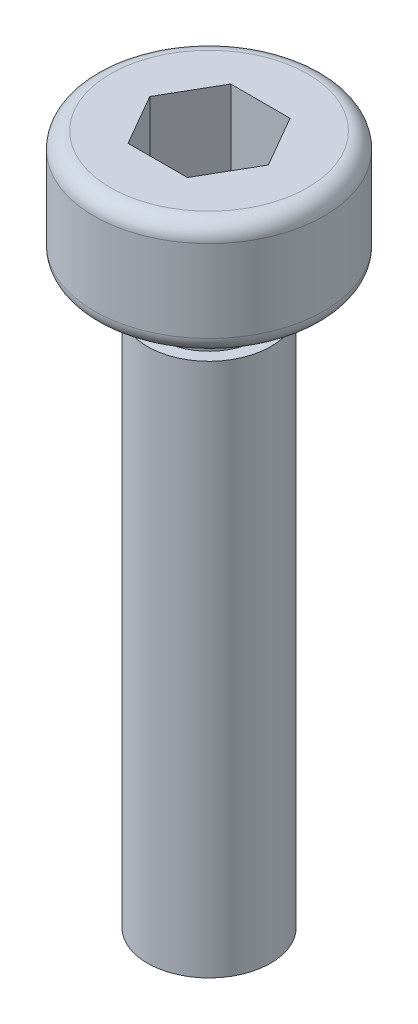
ISO-10303-21;
HEADER;
FILE_DESCRIPTION(('STEP AP214'),'2;1');
FILE_NAME('part.step','',(''),(''),'','','');
FILE_SCHEMA(('AUTOMOTIVE_DESIGN { 1 0 10303 214 1 1 1 1 }'));
ENDSEC;
DATA;
#1=APPLICATION_CONTEXT('core data for automotive mechanical design processes');
#2=APPLICATION_PROTOCOL_DEFINITION('international standard','automotive_design',2000,#1);
#3=PRODUCT_CONTEXT('',#1,'mechanical');
#4=PRODUCT('Part','Part','',(#3));
#5=PRODUCT_RELATED_PRODUCT_CATEGORY('part','',(#4));
#6=PRODUCT_DEFINITION_FORMATION('','',#4);
#7=PRODUCT_DEFINITION_CONTEXT('part definition',#1,'design');
#8=PRODUCT_DEFINITION('design','',#6,#7);
#9=PRODUCT_DEFINITION_SHAPE('','',#8);
#10=(LENGTH_UNIT() NAMED_UNIT(*) SI_UNIT(.MILLI.,.METRE.));
#11=(NAMED_UNIT(*) PLANE_ANGLE_UNIT() SI_UNIT($,.RADIAN.));
#12=(NAMED_UNIT(*) SI_UNIT($,.STERADIAN.) SOLID_ANGLE_UNIT());
#13=UNCERTAINTY_MEASURE_WITH_UNIT(LENGTH_MEASURE(1.E-05),#10,'distance_accuracy_value','');
#14=(GEOMETRIC_REPRESENTATION_CONTEXT(3) GLOBAL_UNCERTAINTY_ASSIGNED_CONTEXT((#13)) GLOBAL_UNIT_ASSIGNED_CONTEXT((#10,
#11,#12)) REPRESENTATION_CONTEXT('',''));
#15=CARTESIAN_POINT('',(0.,0.,0.));
#16=DIRECTION('',(0.,0.,1.));
#17=DIRECTION('',(1.,0.,0.));
#18=AXIS2_PLACEMENT_3D('',#15,#16,#17);
#19=CARTESIAN_POINT('',(0.,16.8,0.));
#20=DIRECTION('',(0.,-1.,0.));
#21=DIRECTION('',(0.,0.,-1.));
#22=AXIS2_PLACEMENT_3D('',#19,#20,#21);
#23=PLANE('',#22);
#24=DIRECTION('',(-0.5,0.,0.866025403784439));
#25=VECTOR('',#24,1.);
#26=CARTESIAN_POINT('',(-0.721687836487032,16.8,-1.25));
#27=LINE('',#26,#25);
#28=CARTESIAN_POINT('',(-0.721687836487032,16.8,-1.25));
#29=VERTEX_POINT('',#28);
#30=CARTESIAN_POINT('',(-1.44337567297406,16.8,0.));
#31=VERTEX_POINT('',#30);
#32=EDGE_CURVE('E126',#29,#31,#27,.T.);
#33=ORIENTED_EDGE('',*,*,#32,.F.);
#34=DIRECTION('',(-1.,0.,0.));
#35=VECTOR('',#34,1.);
#36=CARTESIAN_POINT('',(0.721687836487033,16.8,-1.25));
#37=LINE('',#36,#35);
#38=CARTESIAN_POINT('',(0.721687836487033,16.8,-1.25));
#39=VERTEX_POINT('',#38);
#40=EDGE_CURVE('E52',#39,#29,#37,.T.);
#41=ORIENTED_EDGE('',*,*,#40,.F.);
#42=DIRECTION('',(-0.5,0.,-0.866025403784439));
#43=VECTOR('',#42,1.);
#44=CARTESIAN_POINT('',(1.44337567297406,16.8,0.));
#45=LINE('',#44,#43);
#46=CARTESIAN_POINT('',(1.44337567297406,16.8,0.));
#47=VERTEX_POINT('',#46);
#48=EDGE_CURVE('E135',#47,#39,#45,.T.);
#49=ORIENTED_EDGE('',*,*,#48,.F.);
#50=DIRECTION('',(0.5,0.,-0.866025403784439));
#51=VECTOR('',#50,1.);
#52=CARTESIAN_POINT('',(0.721687836487032,16.8,1.25));
#53=LINE('',#52,#51);
#54=CARTESIAN_POINT('',(0.721687836487032,16.8,1.25));
#55=VERTEX_POINT('',#54);
#56=EDGE_CURVE('E133',#55,#47,#53,.T.);
#57=ORIENTED_EDGE('',*,*,#56,.F.);
#58=DIRECTION('',(1.,0.,0.));
#59=VECTOR('',#58,1.);
#60=CARTESIAN_POINT('',(-0.721687836487033,16.8,1.25));
#61=LINE('',#60,#59);
#62=CARTESIAN_POINT('',(-0.721687836487033,16.8,1.25));
#63=VERTEX_POINT('',#62);
#64=EDGE_CURVE('E100',#63,#55,#61,.T.);
#65=ORIENTED_EDGE('',*,*,#64,.F.);
#66=DIRECTION('',(0.5,0.,0.866025403784439));
#67=VECTOR('',#66,1.);
#68=CARTESIAN_POINT('',(-1.44337567297406,16.8,0.));
#69=LINE('',#68,#67);
#70=EDGE_CURVE('E129',#31,#63,#69,.T.);
#71=ORIENTED_EDGE('',*,*,#70,.F.);
#72=EDGE_LOOP('',(#33,#41,#49,#57,#65,#71));
#73=FACE_BOUND('',#72,.T.);
#74=CARTESIAN_POINT('',(0.,16.8,0.));
#75=DIRECTION('',(0.,-1.,0.));
#76=DIRECTION('',(0.,0.,-1.));
#77=AXIS2_PLACEMENT_3D('',#74,#75,#76);
#78=CIRCLE('',#77,2.4);
#79=CARTESIAN_POINT('',(0.,16.8,-2.4));
#80=VERTEX_POINT('',#79);
#81=EDGE_CURVE('E11',#80,#80,#78,.T.);
#82=ORIENTED_EDGE('',*,*,#81,.F.);
#83=EDGE_LOOP('',(#82));
#84=FACE_BOUND('',#83,.T.);
#85=ADVANCED_FACE('F38',(#73,#84),#23,.F.);
#86=CARTESIAN_POINT('',(0.,16.4,0.));
#87=DIRECTION('',(0.,-1.,0.));
#88=DIRECTION('',(0.,0.,-1.));
#89=AXIS2_PLACEMENT_3D('',#86,#87,#88);
#90=TOROIDAL_SURFACE('',#89,2.4,0.400000000000002);
#91=CARTESIAN_POINT('',(0.,16.4,0.));
#92=DIRECTION('',(0.,-1.,0.));
#93=DIRECTION('',(0.,0.,-1.));
#94=AXIS2_PLACEMENT_3D('',#91,#92,#93);
#95=CIRCLE('',#94,2.8);
#96=CARTESIAN_POINT('',(0.,16.4,-2.8));
#97=VERTEX_POINT('',#96);
#98=EDGE_CURVE('E45',#97,#97,#95,.T.);
#99=ORIENTED_EDGE('',*,*,#98,.F.);
#100=EDGE_LOOP('',(#99));
#101=FACE_BOUND('',#100,.T.);
#102=ORIENTED_EDGE('',*,*,#81,.T.);
#103=EDGE_LOOP('',(#102));
#104=FACE_BOUND('',#103,.T.);
#105=ADVANCED_FACE('F166',(#101,#104),#90,.T.);
#106=CARTESIAN_POINT('',(0.,0.,0.));
#107=DIRECTION('',(0.,-1.,0.));
#108=DIRECTION('',(0.,0.,-1.));
#109=AXIS2_PLACEMENT_3D('',#106,#107,#108);
#110=CYLINDRICAL_SURFACE('',#109,2.8);
#111=CARTESIAN_POINT('',(0.,14.4,0.));
#112=DIRECTION('',(0.,-1.,0.));
#113=DIRECTION('',(0.,0.,-1.));
#114=AXIS2_PLACEMENT_3D('',#111,#112,#113);
#115=CIRCLE('',#114,2.8);
#116=CARTESIAN_POINT('',(0.,14.4,-2.8));
#117=VERTEX_POINT('',#116);
#118=EDGE_CURVE('E159',#117,#117,#115,.T.);
#119=ORIENTED_EDGE('',*,*,#118,.F.);
#120=EDGE_LOOP('',(#119));
#121=FACE_BOUND('',#120,.T.);
#122=ORIENTED_EDGE('',*,*,#98,.T.);
#123=EDGE_LOOP('',(#122));
#124=FACE_BOUND('',#123,.T.);
#125=ADVANCED_FACE('F164',(#121,#124),#110,.T.);
#126=CARTESIAN_POINT('',(0.,14.4,0.));
#127=DIRECTION('',(0.,-1.,0.));
#128=DIRECTION('',(0.,0.,-1.));
#129=AXIS2_PLACEMENT_3D('',#126,#127,#128);
#130=TOROIDAL_SURFACE('',#129,2.4,0.400000000000001);
#131=CARTESIAN_POINT('',(0.,14.,0.));
#132=DIRECTION('',(0.,-1.,0.));
#133=DIRECTION('',(0.,0.,-1.));
#134=AXIS2_PLACEMENT_3D('',#131,#132,#133);
#135=CIRCLE('',#134,2.4);
#136=CARTESIAN_POINT('',(0.,14.,-2.4));
#137=VERTEX_POINT('',#136);
#138=EDGE_CURVE('E156',#137,#137,#135,.T.);
#139=ORIENTED_EDGE('',*,*,#138,.F.);
#140=EDGE_LOOP('',(#139));
#141=FACE_BOUND('',#140,.T.);
#142=ORIENTED_EDGE('',*,*,#118,.T.);
#143=EDGE_LOOP('',(#142));
#144=FACE_BOUND('',#143,.T.);
#145=ADVANCED_FACE('F211',(#141,#144),#130,.T.);
#146=CARTESIAN_POINT('',(-2.4,14.,0.));
#147=DIRECTION('',(0.,1.,0.));
#148=DIRECTION('',(0.,0.,1.));
#149=AXIS2_PLACEMENT_3D('',#146,#147,#148);
#150=PLANE('',#149);
#151=CARTESIAN_POINT('',(0.,14.,0.));
#152=DIRECTION('',(0.,-1.,0.));
#153=DIRECTION('',(0.,0.,-1.));
#154=AXIS2_PLACEMENT_3D('',#151,#152,#153);
#155=CIRCLE('',#154,1.2);
#156=CARTESIAN_POINT('',(0.,14.,-1.2));
#157=VERTEX_POINT('',#156);
#158=EDGE_CURVE('E153',#157,#157,#155,.T.);
#159=ORIENTED_EDGE('',*,*,#158,.F.);
#160=EDGE_LOOP('',(#159));
#161=FACE_BOUND('',#160,.T.);
#162=ORIENTED_EDGE('',*,*,#138,.T.);
#163=EDGE_LOOP('',(#162));
#164=FACE_BOUND('',#163,.T.);
#165=ADVANCED_FACE('F207',(#161,#164),#150,.F.);
#166=CARTESIAN_POINT('',(0.,0.,0.));
#167=DIRECTION('',(0.,-1.,0.));
#168=DIRECTION('',(0.,0.,-1.));
#169=AXIS2_PLACEMENT_3D('',#166,#167,#168);
#170=CYLINDRICAL_SURFACE('',#169,1.2);
#171=CARTESIAN_POINT('',(0.,13.,0.));
#172=DIRECTION('',(0.,-1.,0.));
#173=DIRECTION('',(0.,0.,-1.));
#174=AXIS2_PLACEMENT_3D('',#171,#172,#173);
#175=CIRCLE('',#174,1.2);
#176=CARTESIAN_POINT('',(0.,13.,-1.2));
#177=VERTEX_POINT('',#176);
#178=EDGE_CURVE('E150',#177,#177,#175,.T.);
#179=ORIENTED_EDGE('',*,*,#178,.F.);
#180=EDGE_LOOP('',(#179));
#181=FACE_BOUND('',#180,.T.);
#182=ORIENTED_EDGE('',*,*,#158,.T.);
#183=EDGE_LOOP('',(#182));
#184=FACE_BOUND('',#183,.T.);
#185=ADVANCED_FACE('F203',(#181,#184),#170,.T.);
#186=CARTESIAN_POINT('',(-1.2,13.,0.));
#187=DIRECTION('',(0.,-1.,0.));
#188=DIRECTION('',(0.,0.,-1.));
#189=AXIS2_PLACEMENT_3D('',#186,#187,#188);
#190=PLANE('',#189);
#191=CARTESIAN_POINT('',(0.,13.,0.));
#192=DIRECTION('',(0.,-1.,0.));
#193=DIRECTION('',(0.,0.,-1.));
#194=AXIS2_PLACEMENT_3D('',#191,#192,#193);
#195=CIRCLE('',#194,1.5);
#196=CARTESIAN_POINT('',(0.,13.,-1.5));
#197=VERTEX_POINT('',#196);
#198=EDGE_CURVE('E147',#197,#197,#195,.T.);
#199=ORIENTED_EDGE('',*,*,#198,.F.);
#200=EDGE_LOOP('',(#199));
#201=FACE_BOUND('',#200,.T.);
#202=ORIENTED_EDGE('',*,*,#178,.T.);
#203=EDGE_LOOP('',(#202));
#204=FACE_BOUND('',#203,.T.);
#205=ADVANCED_FACE('F199',(#201,#204),#190,.F.);
#206=CARTESIAN_POINT('',(0.,0.,0.));
#207=DIRECTION('',(0.,-1.,0.));
#208=DIRECTION('',(0.,0.,-1.));
#209=AXIS2_PLACEMENT_3D('',#206,#207,#208);
#210=CYLINDRICAL_SURFACE('',#209,1.5);
#211=CARTESIAN_POINT('',(0.,0.,0.));
#212=DIRECTION('',(0.,-1.,0.));
#213=DIRECTION('',(0.,0.,-1.));
#214=AXIS2_PLACEMENT_3D('',#211,#212,#213);
#215=CIRCLE('',#214,1.5);
#216=CARTESIAN_POINT('',(0.,0.,-1.5));
#217=VERTEX_POINT('',#216);
#218=EDGE_CURVE('E139',#217,#217,#215,.T.);
#219=ORIENTED_EDGE('',*,*,#218,.F.);
#220=EDGE_LOOP('',(#219));
#221=FACE_BOUND('',#220,.T.);
#222=ORIENTED_EDGE('',*,*,#198,.T.);
#223=EDGE_LOOP('',(#222));
#224=FACE_BOUND('',#223,.T.);
#225=ADVANCED_FACE('F191',(#221,#224),#210,.T.);
#226=CARTESIAN_POINT('',(-1.5,0.,0.));
#227=DIRECTION('',(0.,1.,0.));
#228=DIRECTION('',(0.,0.,1.));
#229=AXIS2_PLACEMENT_3D('',#226,#227,#228);
#230=PLANE('',#229);
#231=ORIENTED_EDGE('',*,*,#218,.T.);
#232=EDGE_LOOP('',(#231));
#233=FACE_BOUND('',#232,.T.);
#234=ADVANCED_FACE('F184',(#233),#230,.F.);
#235=CARTESIAN_POINT('',(0.721687836487033,14.8,-1.25));
#236=DIRECTION('',(0.,0.,-1.));
#237=DIRECTION('',(-1.,0.,0.));
#238=AXIS2_PLACEMENT_3D('',#235,#236,#237);
#239=PLANE('',#238);
#240=ORIENTED_EDGE('',*,*,#40,.T.);
#241=DIRECTION('',(0.,1.,0.));
#242=VECTOR('',#241,1.);
#243=CARTESIAN_POINT('',(-0.721687836487032,14.8,-1.25));
#244=LINE('',#243,#242);
#245=CARTESIAN_POINT('',(-0.721687836487032,14.8,-1.25));
#246=VERTEX_POINT('',#245);
#247=EDGE_CURVE('E82',#246,#29,#244,.T.);
#248=ORIENTED_EDGE('',*,*,#247,.F.);
#249=DIRECTION('',(-1.,0.,0.));
#250=VECTOR('',#249,1.);
#251=CARTESIAN_POINT('',(0.721687836487033,14.8,-1.25));
#252=LINE('',#251,#250);
#253=CARTESIAN_POINT('',(0.721687836487033,14.8,-1.25));
#254=VERTEX_POINT('',#253);
#255=EDGE_CURVE('E137',#254,#246,#252,.T.);
#256=ORIENTED_EDGE('',*,*,#255,.F.);
#257=DIRECTION('',(0.,1.,0.));
#258=VECTOR('',#257,1.);
#259=CARTESIAN_POINT('',(0.721687836487033,14.8,-1.25));
#260=LINE('',#259,#258);
#261=EDGE_CURVE('E60',#254,#39,#260,.T.);
#262=ORIENTED_EDGE('',*,*,#261,.T.);
#263=EDGE_LOOP('',(#240,#248,#256,#262));
#264=FACE_BOUND('',#263,.T.);
#265=ADVANCED_FACE('F181',(#264),#239,.F.);
#266=CARTESIAN_POINT('',(1.44337567297406,14.8,0.));
#267=DIRECTION('',(0.866025403784439,0.,-0.5));
#268=DIRECTION('',(-0.5,0.,-0.866025403784439));
#269=AXIS2_PLACEMENT_3D('',#266,#267,#268);
#270=PLANE('',#269);
#271=ORIENTED_EDGE('',*,*,#48,.T.);
#272=ORIENTED_EDGE('',*,*,#261,.F.);
#273=DIRECTION('',(-0.5,0.,-0.866025403784439));
#274=VECTOR('',#273,1.);
#275=CARTESIAN_POINT('',(1.44337567297406,14.8,0.));
#276=LINE('',#275,#274);
#277=CARTESIAN_POINT('',(1.44337567297406,14.8,0.));
#278=VERTEX_POINT('',#277);
#279=EDGE_CURVE('E112',#278,#254,#276,.T.);
#280=ORIENTED_EDGE('',*,*,#279,.F.);
#281=DIRECTION('',(0.,1.,0.));
#282=VECTOR('',#281,1.);
#283=CARTESIAN_POINT('',(1.44337567297406,14.8,0.));
#284=LINE('',#283,#282);
#285=EDGE_CURVE('E104',#278,#47,#284,.T.);
#286=ORIENTED_EDGE('',*,*,#285,.T.);
#287=EDGE_LOOP('',(#271,#272,#280,#286));
#288=FACE_BOUND('',#287,.T.);
#289=ADVANCED_FACE('F183',(#288),#270,.F.);
#290=CARTESIAN_POINT('',(0.721687836487032,14.8,1.25));
#291=DIRECTION('',(0.866025403784439,0.,0.5));
#292=DIRECTION('',(0.5,0.,-0.866025403784439));
#293=AXIS2_PLACEMENT_3D('',#290,#291,#292);
#294=PLANE('',#293);
#295=ORIENTED_EDGE('',*,*,#56,.T.);
#296=ORIENTED_EDGE('',*,*,#285,.F.);
#297=DIRECTION('',(0.5,0.,-0.866025403784439));
#298=VECTOR('',#297,1.);
#299=CARTESIAN_POINT('',(0.721687836487032,14.8,1.25));
#300=LINE('',#299,#298);
#301=CARTESIAN_POINT('',(0.721687836487032,14.8,1.25));
#302=VERTEX_POINT('',#301);
#303=EDGE_CURVE('E108',#302,#278,#300,.T.);
#304=ORIENTED_EDGE('',*,*,#303,.F.);
#305=DIRECTION('',(0.,1.,0.));
#306=VECTOR('',#305,1.);
#307=CARTESIAN_POINT('',(0.721687836487032,14.8,1.25));
#308=LINE('',#307,#306);
#309=EDGE_CURVE('E93',#302,#55,#308,.T.);
#310=ORIENTED_EDGE('',*,*,#309,.T.);
#311=EDGE_LOOP('',(#295,#296,#304,#310));
#312=FACE_BOUND('',#311,.T.);
#313=ADVANCED_FACE('F109',(#312),#294,.F.);
#314=CARTESIAN_POINT('',(-0.721687836487033,14.8,1.25));
#315=DIRECTION('',(0.,0.,1.));
#316=DIRECTION('',(1.,0.,0.));
#317=AXIS2_PLACEMENT_3D('',#314,#315,#316);
#318=PLANE('',#317);
#319=ORIENTED_EDGE('',*,*,#64,.T.);
#320=ORIENTED_EDGE('',*,*,#309,.F.);
#321=DIRECTION('',(1.,0.,0.));
#322=VECTOR('',#321,1.);
#323=CARTESIAN_POINT('',(-0.721687836487033,14.8,1.25));
#324=LINE('',#323,#322);
#325=CARTESIAN_POINT('',(-0.721687836487033,14.8,1.25));
#326=VERTEX_POINT('',#325);
#327=EDGE_CURVE('E97',#326,#302,#324,.T.);
#328=ORIENTED_EDGE('',*,*,#327,.F.);
#329=DIRECTION('',(0.,1.,0.));
#330=VECTOR('',#329,1.);
#331=CARTESIAN_POINT('',(-0.721687836487033,14.8,1.25));
#332=LINE('',#331,#330);
#333=EDGE_CURVE('E105',#326,#63,#332,.T.);
#334=ORIENTED_EDGE('',*,*,#333,.T.);
#335=EDGE_LOOP('',(#319,#320,#328,#334));
#336=FACE_BOUND('',#335,.T.);
#337=ADVANCED_FACE('F95',(#336),#318,.F.);
#338=CARTESIAN_POINT('',(-1.44337567297406,14.8,0.));
#339=DIRECTION('',(-0.866025403784439,0.,0.5));
#340=DIRECTION('',(0.5,0.,0.866025403784439));
#341=AXIS2_PLACEMENT_3D('',#338,#339,#340);
#342=PLANE('',#341);
#343=ORIENTED_EDGE('',*,*,#70,.T.);
#344=ORIENTED_EDGE('',*,*,#333,.F.);
#345=DIRECTION('',(0.5,0.,0.866025403784439));
#346=VECTOR('',#345,1.);
#347=CARTESIAN_POINT('',(-1.44337567297406,14.8,0.));
#348=LINE('',#347,#346);
#349=CARTESIAN_POINT('',(-1.44337567297406,14.8,0.));
#350=VERTEX_POINT('',#349);
#351=EDGE_CURVE('E118',#350,#326,#348,.T.);
#352=ORIENTED_EDGE('',*,*,#351,.F.);
#353=DIRECTION('',(0.,1.,0.));
#354=VECTOR('',#353,1.);
#355=CARTESIAN_POINT('',(-1.44337567297406,14.8,0.));
#356=LINE('',#355,#354);
#357=EDGE_CURVE('E142',#350,#31,#356,.T.);
#358=ORIENTED_EDGE('',*,*,#357,.T.);
#359=EDGE_LOOP('',(#343,#344,#352,#358));
#360=FACE_BOUND('',#359,.T.);
#361=ADVANCED_FACE('F282',(#360),#342,.F.);
#362=CARTESIAN_POINT('',(-0.721687836487032,14.8,-1.25));
#363=DIRECTION('',(-0.866025403784439,0.,-0.5));
#364=DIRECTION('',(-0.5,0.,0.866025403784439));
#365=AXIS2_PLACEMENT_3D('',#362,#363,#364);
#366=PLANE('',#365);
#367=ORIENTED_EDGE('',*,*,#32,.T.);
#368=ORIENTED_EDGE('',*,*,#357,.F.);
#369=DIRECTION('',(-0.5,0.,0.866025403784439));
#370=VECTOR('',#369,1.);
#371=CARTESIAN_POINT('',(-0.721687836487032,14.8,-1.25));
#372=LINE('',#371,#370);
#373=EDGE_CURVE('E120',#246,#350,#372,.T.);
#374=ORIENTED_EDGE('',*,*,#373,.F.);
#375=ORIENTED_EDGE('',*,*,#247,.T.);
#376=EDGE_LOOP('',(#367,#368,#374,#375));
#377=FACE_BOUND('',#376,.T.);
#378=ADVANCED_FACE('F179',(#377),#366,.F.);
#379=CARTESIAN_POINT('',(0.,14.8,0.));
#380=DIRECTION('',(0.,1.,0.));
#381=DIRECTION('',(0.,0.,1.));
#382=AXIS2_PLACEMENT_3D('',#379,#380,#381);
#383=PLANE('',#382);
#384=ORIENTED_EDGE('',*,*,#255,.T.);
#385=ORIENTED_EDGE('',*,*,#373,.T.);
#386=ORIENTED_EDGE('',*,*,#351,.T.);
#387=ORIENTED_EDGE('',*,*,#327,.T.);
#388=ORIENTED_EDGE('',*,*,#303,.T.);
#389=ORIENTED_EDGE('',*,*,#279,.T.);
#390=EDGE_LOOP('',(#384,#385,#386,#387,#388,#389));
#391=FACE_BOUND('',#390,.T.);
#392=ADVANCED_FACE('F115',(#391),#383,.T.);
#393=CLOSED_SHELL('',(#85,#105,#125,#145,#165,#185,#205,#225,#234,#265,#289,#313,#337,#361,#378,#392));
#394=MANIFOLD_SOLID_BREP('B2',#393);
#395=ADVANCED_BREP_SHAPE_REPRESENTATION('',(#18,#394),#14);
#396=SHAPE_DEFINITION_REPRESENTATION(#9,#395);
ENDSEC;
END-ISO-10303-21;
